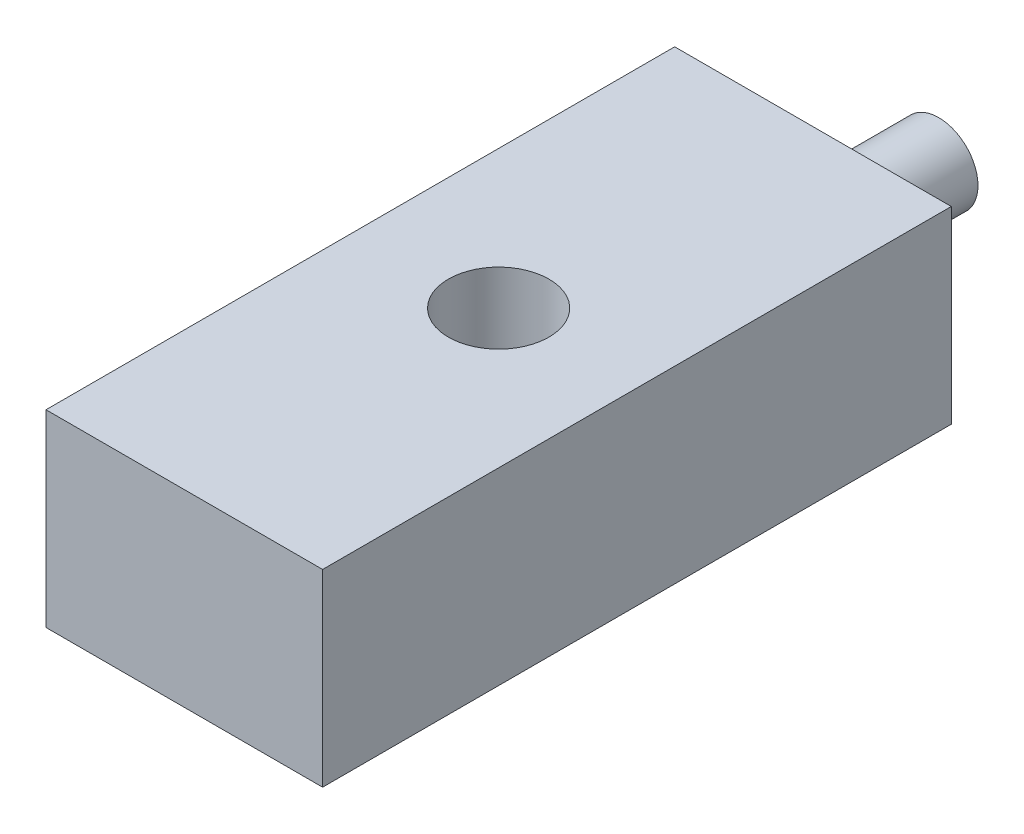
ISO-10303-21;
HEADER;
FILE_DESCRIPTION(('STEP AP214'),'2;1');
FILE_NAME('part.step','',(''),(''),'','','');
FILE_SCHEMA(('AUTOMOTIVE_DESIGN { 1 0 10303 214 1 1 1 1 }'));
ENDSEC;
DATA;
#1=APPLICATION_CONTEXT('core data for automotive mechanical design processes');
#2=APPLICATION_PROTOCOL_DEFINITION('international standard','automotive_design',2000,#1);
#3=PRODUCT_CONTEXT('',#1,'mechanical');
#4=PRODUCT('Part','Part','',(#3));
#5=PRODUCT_RELATED_PRODUCT_CATEGORY('part','',(#4));
#6=PRODUCT_DEFINITION_FORMATION('','',#4);
#7=PRODUCT_DEFINITION_CONTEXT('part definition',#1,'design');
#8=PRODUCT_DEFINITION('design','',#6,#7);
#9=PRODUCT_DEFINITION_SHAPE('','',#8);
#10=(LENGTH_UNIT() NAMED_UNIT(*) SI_UNIT(.MILLI.,.METRE.));
#11=(NAMED_UNIT(*) PLANE_ANGLE_UNIT() SI_UNIT($,.RADIAN.));
#12=(NAMED_UNIT(*) SI_UNIT($,.STERADIAN.) SOLID_ANGLE_UNIT());
#13=UNCERTAINTY_MEASURE_WITH_UNIT(LENGTH_MEASURE(1.E-05),#10,'distance_accuracy_value','');
#14=(GEOMETRIC_REPRESENTATION_CONTEXT(3) GLOBAL_UNCERTAINTY_ASSIGNED_CONTEXT((#13)) GLOBAL_UNIT_ASSIGNED_CONTEXT((#10,
#11,#12)) REPRESENTATION_CONTEXT('',''));
#15=CARTESIAN_POINT('',(0.,0.,0.));
#16=DIRECTION('',(0.,0.,1.));
#17=DIRECTION('',(1.,0.,0.));
#18=AXIS2_PLACEMENT_3D('',#15,#16,#17);
#19=CARTESIAN_POINT('',(0.140065101539152,8.03928983405398,0.));
#20=DIRECTION('',(0.,0.,1.));
#21=DIRECTION('',(1.,0.,0.));
#22=AXIS2_PLACEMENT_3D('',#19,#20,#21);
#23=PLANE('',#22);
#24=CARTESIAN_POINT('',(0.140065101539152,8.03928983405398,0.));
#25=DIRECTION('',(0.,0.,1.));
#26=DIRECTION('',(1.,0.,0.));
#27=AXIS2_PLACEMENT_3D('',#24,#25,#26);
#28=CIRCLE('',#27,3.1250000000006);
#29=CARTESIAN_POINT('',(3.26506510153976,8.03928983405398,0.));
#30=VERTEX_POINT('',#29);
#31=EDGE_CURVE('E43',#30,#30,#28,.T.);
#32=ORIENTED_EDGE('',*,*,#31,.F.);
#33=EDGE_LOOP('',(#32));
#34=FACE_BOUND('',#33,.T.);
#35=CARTESIAN_POINT('',(0.140065101539152,8.03928983405398,0.));
#36=DIRECTION('',(0.,0.,1.));
#37=DIRECTION('',(1.,0.,0.));
#38=AXIS2_PLACEMENT_3D('',#35,#36,#37);
#39=CIRCLE('',#38,2.7000000000016);
#40=CARTESIAN_POINT('',(2.84006510154075,8.03928983405398,0.));
#41=VERTEX_POINT('',#40);
#42=EDGE_CURVE('E120',#41,#41,#39,.T.);
#43=ORIENTED_EDGE('',*,*,#42,.T.);
#44=EDGE_LOOP('',(#43));
#45=FACE_BOUND('',#44,.T.);
#46=ADVANCED_FACE('F39',(#34,#45),#23,.F.);
#47=CARTESIAN_POINT('',(0.140065101539152,8.03928983405398,10.));
#48=DIRECTION('',(0.,0.,-1.));
#49=DIRECTION('',(-1.,0.,0.));
#50=AXIS2_PLACEMENT_3D('',#47,#48,#49);
#51=CYLINDRICAL_SURFACE('',#50,3.1250000000006);
#52=CARTESIAN_POINT('',(0.140065101539152,8.03928983405398,10.));
#53=DIRECTION('',(0.,0.,1.));
#54=DIRECTION('',(1.,0.,0.));
#55=AXIS2_PLACEMENT_3D('',#52,#53,#54);
#56=CIRCLE('',#55,3.1250000000006);
#57=CARTESIAN_POINT('',(3.26506510153976,8.03928983405398,10.));
#58=VERTEX_POINT('',#57);
#59=EDGE_CURVE('E12',#58,#58,#56,.T.);
#60=ORIENTED_EDGE('',*,*,#59,.F.);
#61=EDGE_LOOP('',(#60));
#62=FACE_BOUND('',#61,.T.);
#63=ORIENTED_EDGE('',*,*,#31,.T.);
#64=EDGE_LOOP('',(#63));
#65=FACE_BOUND('',#64,.T.);
#66=ADVANCED_FACE('F41',(#62,#65),#51,.T.);
#67=CARTESIAN_POINT('',(0.140065101539152,8.03928983405398,10.));
#68=DIRECTION('',(0.,0.,-1.));
#69=DIRECTION('',(-1.,0.,0.));
#70=AXIS2_PLACEMENT_3D('',#67,#68,#69);
#71=CYLINDRICAL_SURFACE('',#70,2.7000000000016);
#72=CARTESIAN_POINT('',(0.140065101539152,8.03928983405398,10.));
#73=DIRECTION('',(0.,0.,1.));
#74=DIRECTION('',(1.,0.,0.));
#75=AXIS2_PLACEMENT_3D('',#72,#73,#74);
#76=CIRCLE('',#75,2.7000000000016);
#77=CARTESIAN_POINT('',(2.84006510154075,8.03928983405398,10.));
#78=VERTEX_POINT('',#77);
#79=EDGE_CURVE('E117',#78,#78,#76,.T.);
#80=ORIENTED_EDGE('',*,*,#79,.T.);
#81=EDGE_LOOP('',(#80));
#82=FACE_BOUND('',#81,.T.);
#83=ORIENTED_EDGE('',*,*,#42,.F.);
#84=EDGE_LOOP('',(#83));
#85=FACE_BOUND('',#84,.T.);
#86=ADVANCED_FACE('F132',(#82,#85),#71,.F.);
#87=CARTESIAN_POINT('',(0.,0.,10.));
#88=DIRECTION('',(0.,0.,1.));
#89=DIRECTION('',(1.,0.,0.));
#90=AXIS2_PLACEMENT_3D('',#87,#88,#89);
#91=PLANE('',#90);
#92=ORIENTED_EDGE('',*,*,#79,.F.);
#93=EDGE_LOOP('',(#92));
#94=FACE_BOUND('',#93,.T.);
#95=ADVANCED_FACE('F137',(#94),#91,.F.);
#96=CARTESIAN_POINT('',(-10.859934898463,0.539289834053012,60.));
#97=DIRECTION('',(1.,0.,0.));
#98=DIRECTION('',(0.,0.,-1.));
#99=AXIS2_PLACEMENT_3D('',#96,#97,#98);
#100=PLANE('',#99);
#101=DIRECTION('',(0.,-1.,0.));
#102=VECTOR('',#101,1.);
#103=CARTESIAN_POINT('',(-10.859934898463,0.539289834053012,10.));
#104=LINE('',#103,#102);
#105=CARTESIAN_POINT('',(-10.859934898463,15.539289834053,10.));
#106=VERTEX_POINT('',#105);
#107=CARTESIAN_POINT('',(-10.859934898463,0.539289834053012,10.));
#108=VERTEX_POINT('',#107);
#109=EDGE_CURVE('E107',#106,#108,#104,.T.);
#110=ORIENTED_EDGE('',*,*,#109,.T.);
#111=DIRECTION('',(0.,0.,-1.));
#112=VECTOR('',#111,1.);
#113=CARTESIAN_POINT('',(-10.859934898463,0.539289834053012,60.));
#114=LINE('',#113,#112);
#115=CARTESIAN_POINT('',(-10.859934898463,0.539289834053012,60.));
#116=VERTEX_POINT('',#115);
#117=EDGE_CURVE('E98',#116,#108,#114,.T.);
#118=ORIENTED_EDGE('',*,*,#117,.F.);
#119=DIRECTION('',(0.,-1.,0.));
#120=VECTOR('',#119,1.);
#121=CARTESIAN_POINT('',(-10.859934898463,0.539289834053012,60.));
#122=LINE('',#121,#120);
#123=CARTESIAN_POINT('',(-10.859934898463,15.539289834053,60.));
#124=VERTEX_POINT('',#123);
#125=EDGE_CURVE('E92',#124,#116,#122,.T.);
#126=ORIENTED_EDGE('',*,*,#125,.F.);
#127=DIRECTION('',(0.,0.,-1.));
#128=VECTOR('',#127,1.);
#129=CARTESIAN_POINT('',(-10.859934898463,15.539289834053,60.));
#130=LINE('',#129,#128);
#131=EDGE_CURVE('E103',#124,#106,#130,.T.);
#132=ORIENTED_EDGE('',*,*,#131,.T.);
#133=EDGE_LOOP('',(#110,#118,#126,#132));
#134=FACE_BOUND('',#133,.T.);
#135=ADVANCED_FACE('F139',(#134),#100,.F.);
#136=CARTESIAN_POINT('',(11.140065101537,0.539289834053014,60.));
#137=DIRECTION('',(0.,1.,0.));
#138=DIRECTION('',(-1.,0.,0.));
#139=AXIS2_PLACEMENT_3D('',#136,#137,#138);
#140=PLANE('',#139);
#141=CARTESIAN_POINT('',(0.140065101536991,0.539289834053013,35.));
#142=DIRECTION('',(0.,-1.,0.));
#143=DIRECTION('',(0.,0.,-1.));
#144=AXIS2_PLACEMENT_3D('',#141,#142,#143);
#145=CIRCLE('',#144,4.00000000000491);
#146=CARTESIAN_POINT('',(0.140065101536991,0.539289834053013,30.9999999999951));
#147=VERTEX_POINT('',#146);
#148=EDGE_CURVE('E168',#147,#147,#145,.T.);
#149=ORIENTED_EDGE('',*,*,#148,.F.);
#150=EDGE_LOOP('',(#149));
#151=FACE_BOUND('',#150,.T.);
#152=DIRECTION('',(1.,0.,0.));
#153=VECTOR('',#152,1.);
#154=CARTESIAN_POINT('',(11.140065101537,0.539289834053014,10.));
#155=LINE('',#154,#153);
#156=CARTESIAN_POINT('',(11.140065101537,0.539289834053014,10.));
#157=VERTEX_POINT('',#156);
#158=EDGE_CURVE('E97',#108,#157,#155,.T.);
#159=ORIENTED_EDGE('',*,*,#158,.T.);
#160=DIRECTION('',(0.,0.,-1.));
#161=VECTOR('',#160,1.);
#162=CARTESIAN_POINT('',(11.140065101537,0.539289834053014,60.));
#163=LINE('',#162,#161);
#164=CARTESIAN_POINT('',(11.140065101537,0.539289834053014,60.));
#165=VERTEX_POINT('',#164);
#166=EDGE_CURVE('E95',#165,#157,#163,.T.);
#167=ORIENTED_EDGE('',*,*,#166,.F.);
#168=DIRECTION('',(1.,0.,0.));
#169=VECTOR('',#168,1.);
#170=CARTESIAN_POINT('',(11.140065101537,0.539289834053014,60.));
#171=LINE('',#170,#169);
#172=EDGE_CURVE('E87',#116,#165,#171,.T.);
#173=ORIENTED_EDGE('',*,*,#172,.F.);
#174=ORIENTED_EDGE('',*,*,#117,.T.);
#175=EDGE_LOOP('',(#159,#167,#173,#174));
#176=FACE_BOUND('',#175,.T.);
#177=ADVANCED_FACE('F96',(#151,#176),#140,.F.);
#178=CARTESIAN_POINT('',(11.140065101537,0.539289834053014,60.));
#179=DIRECTION('',(-1.,0.,0.));
#180=DIRECTION('',(0.,0.,1.));
#181=AXIS2_PLACEMENT_3D('',#178,#179,#180);
#182=PLANE('',#181);
#183=DIRECTION('',(0.,1.,0.));
#184=VECTOR('',#183,1.);
#185=CARTESIAN_POINT('',(11.140065101537,0.539289834053014,10.));
#186=LINE('',#185,#184);
#187=CARTESIAN_POINT('',(11.140065101537,15.539289834053,10.));
#188=VERTEX_POINT('',#187);
#189=EDGE_CURVE('E73',#157,#188,#186,.T.);
#190=ORIENTED_EDGE('',*,*,#189,.T.);
#191=DIRECTION('',(0.,0.,-1.));
#192=VECTOR('',#191,1.);
#193=CARTESIAN_POINT('',(11.140065101537,15.539289834053,60.));
#194=LINE('',#193,#192);
#195=CARTESIAN_POINT('',(11.140065101537,15.539289834053,60.));
#196=VERTEX_POINT('',#195);
#197=EDGE_CURVE('E99',#196,#188,#194,.T.);
#198=ORIENTED_EDGE('',*,*,#197,.F.);
#199=DIRECTION('',(0.,1.,0.));
#200=VECTOR('',#199,1.);
#201=CARTESIAN_POINT('',(11.140065101537,0.539289834053014,60.));
#202=LINE('',#201,#200);
#203=EDGE_CURVE('E90',#165,#196,#202,.T.);
#204=ORIENTED_EDGE('',*,*,#203,.F.);
#205=ORIENTED_EDGE('',*,*,#166,.T.);
#206=EDGE_LOOP('',(#190,#198,#204,#205));
#207=FACE_BOUND('',#206,.T.);
#208=ADVANCED_FACE('F101',(#207),#182,.F.);
#209=CARTESIAN_POINT('',(11.140065101537,15.539289834053,60.));
#210=DIRECTION('',(0.,-1.,0.));
#211=DIRECTION('',(1.,0.,0.));
#212=AXIS2_PLACEMENT_3D('',#209,#210,#211);
#213=PLANE('',#212);
#214=CARTESIAN_POINT('',(0.140065101536991,15.539289834053,35.));
#215=DIRECTION('',(0.,-1.,0.));
#216=DIRECTION('',(0.,0.,-1.));
#217=AXIS2_PLACEMENT_3D('',#214,#215,#216);
#218=CIRCLE('',#217,4.00000000000491);
#219=CARTESIAN_POINT('',(0.140065101536991,15.539289834053,30.9999999999951));
#220=VERTEX_POINT('',#219);
#221=EDGE_CURVE('E110',#220,#220,#218,.T.);
#222=ORIENTED_EDGE('',*,*,#221,.T.);
#223=EDGE_LOOP('',(#222));
#224=FACE_BOUND('',#223,.T.);
#225=DIRECTION('',(-1.,0.,0.));
#226=VECTOR('',#225,1.);
#227=CARTESIAN_POINT('',(11.140065101537,15.539289834053,10.));
#228=LINE('',#227,#226);
#229=EDGE_CURVE('E79',#188,#106,#228,.T.);
#230=ORIENTED_EDGE('',*,*,#229,.T.);
#231=ORIENTED_EDGE('',*,*,#131,.F.);
#232=DIRECTION('',(-1.,0.,0.));
#233=VECTOR('',#232,1.);
#234=CARTESIAN_POINT('',(11.140065101537,15.539289834053,60.));
#235=LINE('',#234,#233);
#236=EDGE_CURVE('E56',#196,#124,#235,.T.);
#237=ORIENTED_EDGE('',*,*,#236,.F.);
#238=ORIENTED_EDGE('',*,*,#197,.T.);
#239=EDGE_LOOP('',(#230,#231,#237,#238));
#240=FACE_BOUND('',#239,.T.);
#241=ADVANCED_FACE('F148',(#224,#240),#213,.F.);
#242=CARTESIAN_POINT('',(0.,0.,60.));
#243=DIRECTION('',(0.,0.,1.));
#244=DIRECTION('',(1.,0.,0.));
#245=AXIS2_PLACEMENT_3D('',#242,#243,#244);
#246=PLANE('',#245);
#247=ORIENTED_EDGE('',*,*,#125,.T.);
#248=ORIENTED_EDGE('',*,*,#172,.T.);
#249=ORIENTED_EDGE('',*,*,#203,.T.);
#250=ORIENTED_EDGE('',*,*,#236,.T.);
#251=EDGE_LOOP('',(#247,#248,#249,#250));
#252=FACE_BOUND('',#251,.T.);
#253=ADVANCED_FACE('F88',(#252),#246,.T.);
#254=ORIENTED_EDGE('',*,*,#59,.T.);
#255=EDGE_LOOP('',(#254));
#256=FACE_BOUND('',#255,.T.);
#257=ORIENTED_EDGE('',*,*,#109,.F.);
#258=ORIENTED_EDGE('',*,*,#229,.F.);
#259=ORIENTED_EDGE('',*,*,#189,.F.);
#260=ORIENTED_EDGE('',*,*,#158,.F.);
#261=EDGE_LOOP('',(#257,#258,#259,#260));
#262=FACE_BOUND('',#261,.T.);
#263=ADVANCED_FACE('F152',(#256,#262),#91,.F.);
#264=CARTESIAN_POINT('',(0.140065101536991,15.539289834053,35.));
#265=DIRECTION('',(0.,-1.,0.));
#266=DIRECTION('',(0.,0.,-1.));
#267=AXIS2_PLACEMENT_3D('',#264,#265,#266);
#268=CYLINDRICAL_SURFACE('',#267,4.00000000000491);
#269=CARTESIAN_POINT('',(0.140065101536991,15.539289834053,30.9999999999951));
#270=CARTESIAN_POINT('',(0.140065101536991,15.383039834053,30.9999999999951));
#271=CARTESIAN_POINT('',(0.140065101536991,15.226789834053,30.9999999999951));
#272=CARTESIAN_POINT('',(0.140065101536991,14.914289834053,30.9999999999951));
#273=CARTESIAN_POINT('',(0.140065101536991,14.758039834053,30.9999999999951));
#274=CARTESIAN_POINT('',(0.140065101536991,14.445539834053,30.9999999999951));
#275=CARTESIAN_POINT('',(0.140065101536991,14.289289834053,30.9999999999951));
#276=CARTESIAN_POINT('',(0.140065101536991,13.976789834053,30.9999999999951));
#277=CARTESIAN_POINT('',(0.140065101536991,13.820539834053,30.9999999999951));
#278=CARTESIAN_POINT('',(0.140065101536991,13.508039834053,30.9999999999951));
#279=CARTESIAN_POINT('',(0.140065101536991,13.351789834053,30.9999999999951));
#280=CARTESIAN_POINT('',(0.140065101536991,13.039289834053,30.9999999999951));
#281=CARTESIAN_POINT('',(0.140065101536991,12.883039834053,30.9999999999951));
#282=CARTESIAN_POINT('',(0.140065101536991,12.570539834053,30.9999999999951));
#283=CARTESIAN_POINT('',(0.140065101536991,12.414289834053,30.9999999999951));
#284=CARTESIAN_POINT('',(0.140065101536991,12.101789834053,30.9999999999951));
#285=CARTESIAN_POINT('',(0.140065101536991,11.945539834053,30.9999999999951));
#286=CARTESIAN_POINT('',(0.140065101536991,11.633039834053,30.9999999999951));
#287=CARTESIAN_POINT('',(0.140065101536991,11.476789834053,30.9999999999951));
#288=CARTESIAN_POINT('',(0.140065101536991,11.164289834053,30.9999999999951));
#289=CARTESIAN_POINT('',(0.140065101536991,11.008039834053,30.9999999999951));
#290=CARTESIAN_POINT('',(0.140065101536991,10.695539834053,30.9999999999951));
#291=CARTESIAN_POINT('',(0.140065101536991,10.539289834053,30.9999999999951));
#292=CARTESIAN_POINT('',(0.140065101536991,10.226789834053,30.9999999999951));
#293=CARTESIAN_POINT('',(0.140065101536991,10.070539834053,30.9999999999951));
#294=CARTESIAN_POINT('',(0.140065101536991,9.75803983405301,30.9999999999951));
#295=CARTESIAN_POINT('',(0.140065101536991,9.60178983405301,30.9999999999951));
#296=CARTESIAN_POINT('',(0.140065101536991,9.28928983405301,30.9999999999951));
#297=CARTESIAN_POINT('',(0.140065101536991,9.13303983405301,30.9999999999951));
#298=CARTESIAN_POINT('',(0.140065101536991,8.82053983405301,30.9999999999951));
#299=CARTESIAN_POINT('',(0.140065101536991,8.66428983405301,30.9999999999951));
#300=CARTESIAN_POINT('',(0.140065101536991,8.35178983405301,30.9999999999951));
#301=CARTESIAN_POINT('',(0.140065101536991,8.19553983405301,30.9999999999951));
#302=CARTESIAN_POINT('',(0.140065101536991,7.88303983405301,30.9999999999951));
#303=CARTESIAN_POINT('',(0.140065101536991,7.72678983405301,30.9999999999951));
#304=CARTESIAN_POINT('',(0.140065101536991,7.41428983405302,30.9999999999951));
#305=CARTESIAN_POINT('',(0.140065101536991,7.25803983405302,30.9999999999951));
#306=CARTESIAN_POINT('',(0.140065101536991,6.94553983405301,30.9999999999951));
#307=CARTESIAN_POINT('',(0.140065101536991,6.78928983405301,30.9999999999951));
#308=CARTESIAN_POINT('',(0.140065101536991,6.47678983405301,30.9999999999951));
#309=CARTESIAN_POINT('',(0.140065101536991,6.32053983405301,30.9999999999951));
#310=CARTESIAN_POINT('',(0.140065101536991,6.00803983405301,30.9999999999951));
#311=CARTESIAN_POINT('',(0.140065101536991,5.85178983405301,30.9999999999951));
#312=CARTESIAN_POINT('',(0.140065101536991,5.53928983405301,30.9999999999951));
#313=CARTESIAN_POINT('',(0.140065101536991,5.38303983405301,30.9999999999951));
#314=CARTESIAN_POINT('',(0.140065101536991,5.07053983405301,30.9999999999951));
#315=CARTESIAN_POINT('',(0.140065101536991,4.91428983405301,30.9999999999951));
#316=CARTESIAN_POINT('',(0.140065101536991,4.60178983405301,30.9999999999951));
#317=CARTESIAN_POINT('',(0.140065101536991,4.44553983405301,30.9999999999951));
#318=CARTESIAN_POINT('',(0.140065101536991,4.13303983405301,30.9999999999951));
#319=CARTESIAN_POINT('',(0.140065101536991,3.97678983405301,30.9999999999951));
#320=CARTESIAN_POINT('',(0.140065101536991,3.66428983405301,30.9999999999951));
#321=CARTESIAN_POINT('',(0.140065101536991,3.50803983405301,30.9999999999951));
#322=CARTESIAN_POINT('',(0.140065101536991,3.19553983405301,30.9999999999951));
#323=CARTESIAN_POINT('',(0.140065101536991,3.03928983405301,30.9999999999951));
#324=CARTESIAN_POINT('',(0.140065101536991,2.72678983405301,30.9999999999951));
#325=CARTESIAN_POINT('',(0.140065101536991,2.57053983405301,30.9999999999951));
#326=CARTESIAN_POINT('',(0.140065101536991,2.25803983405301,30.9999999999951));
#327=CARTESIAN_POINT('',(0.140065101536991,2.10178983405301,30.9999999999951));
#328=CARTESIAN_POINT('',(0.140065101536991,1.78928983405301,30.9999999999951));
#329=CARTESIAN_POINT('',(0.140065101536991,1.63303983405301,30.9999999999951));
#330=CARTESIAN_POINT('',(0.140065101536991,1.32053983405301,30.9999999999951));
#331=CARTESIAN_POINT('',(0.140065101536991,1.16428983405301,30.9999999999951));
#332=CARTESIAN_POINT('',(0.140065101536991,0.851789834053013,30.9999999999951));
#333=CARTESIAN_POINT('',(0.140065101536991,0.695539834053013,30.9999999999951));
#334=CARTESIAN_POINT('',(0.140065101536991,0.539289834053013,30.9999999999951));
#335=B_SPLINE_CURVE_WITH_KNOTS('',3,(#269,#270,#271,#272,#273,#274,#275,#276,#277,#278,#279,
#280,#281,#282,#283,#284,#285,#286,#287,#288,#289,#290,#291,#292,#293,#294,#295,#296,#297,#298,
#299,#300,#301,#302,#303,#304,#305,#306,#307,#308,#309,#310,#311,#312,#313,#314,#315,#316,#317,
#318,#319,#320,#321,#322,#323,#324,#325,#326,#327,#328,#329,#330,#331,#332,#333,#334),
.UNSPECIFIED.,.F.,.F.,(4,2,2,2,2,2,2,2,2,2,2,2,2,2,2,2,2,2,2,2,2,2,2,2,2,2,2,2,2,2,2,2,4),(0.,
0.46875,0.937500000000001,1.40625,1.875,2.34375,2.8125,3.28125,3.75,4.21875,4.6875,5.15625,
5.625,6.09375,6.5625,7.03125,7.5,7.96875,8.4375,8.90625,9.375,9.84375,10.3125,10.78125,11.25,
11.71875,12.1875,12.65625,13.125,13.59375,14.0625,14.53125,15.),.UNSPECIFIED.);
#336=EDGE_CURVE('BSEAM155',#220,#147,#335,.T.);
#337=ORIENTED_EDGE('',*,*,#221,.F.);
#338=ORIENTED_EDGE('',*,*,#148,.T.);
#339=ORIENTED_EDGE('',*,*,#336,.T.);
#340=ORIENTED_EDGE('',*,*,#336,.F.);
#341=EDGE_LOOP('',(#337,#339,#338,#340));
#342=FACE_BOUND('',#341,.T.);
#343=ADVANCED_FACE('F155',(#342),#268,.F.);
#344=CLOSED_SHELL('',(#46,#66,#86,#95,#135,#177,#208,#241,#253,#263,#343));
#345=MANIFOLD_SOLID_BREP('B2',#344);
#346=ADVANCED_BREP_SHAPE_REPRESENTATION('',(#18,#345),#14);
#347=SHAPE_DEFINITION_REPRESENTATION(#9,#346);
ENDSEC;
END-ISO-10303-21;
